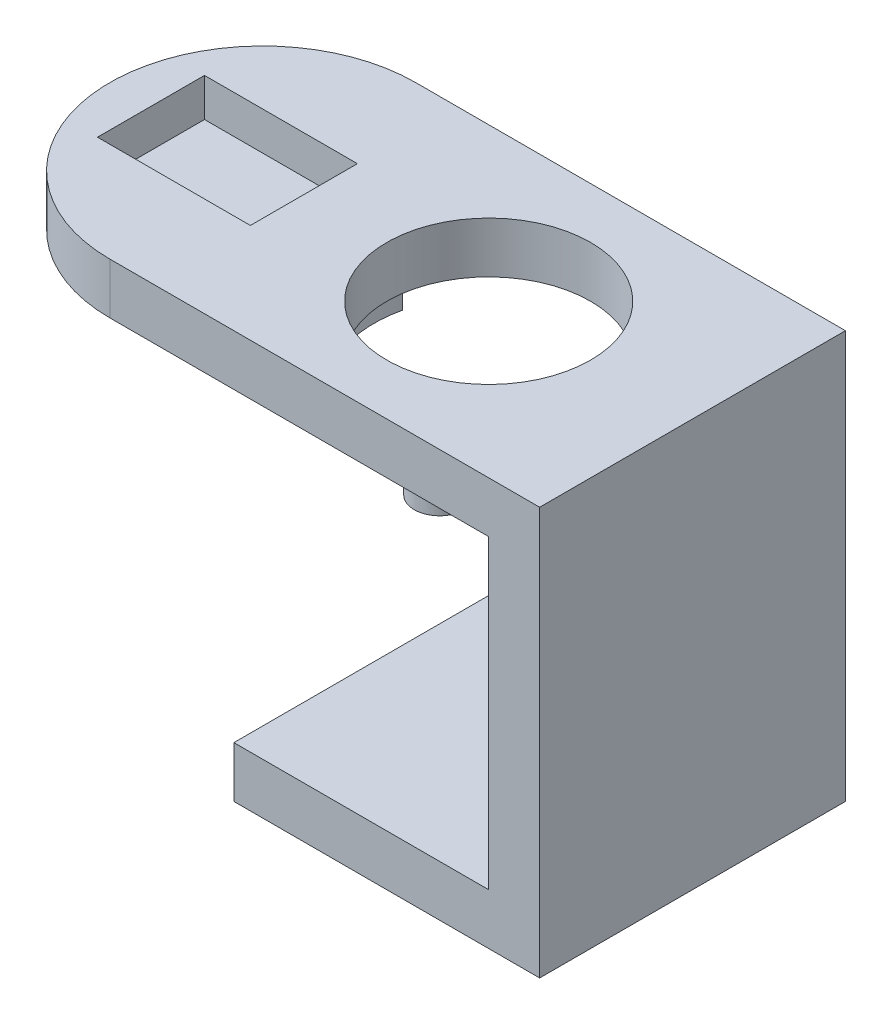
ISO-10303-21;
HEADER;
FILE_DESCRIPTION(('STEP AP214'),'2;1');
FILE_NAME('part.step','',(''),(''),'','','');
FILE_SCHEMA(('AUTOMOTIVE_DESIGN { 1 0 10303 214 1 1 1 1 }'));
ENDSEC;
DATA;
#1=APPLICATION_CONTEXT('core data for automotive mechanical design processes');
#2=APPLICATION_PROTOCOL_DEFINITION('international standard','automotive_design',2000,#1);
#3=PRODUCT_CONTEXT('',#1,'mechanical');
#4=PRODUCT('Part','Part','',(#3));
#5=PRODUCT_RELATED_PRODUCT_CATEGORY('part','',(#4));
#6=PRODUCT_DEFINITION_FORMATION('','',#4);
#7=PRODUCT_DEFINITION_CONTEXT('part definition',#1,'design');
#8=PRODUCT_DEFINITION('design','',#6,#7);
#9=PRODUCT_DEFINITION_SHAPE('','',#8);
#10=(LENGTH_UNIT() NAMED_UNIT(*) SI_UNIT(.MILLI.,.METRE.));
#11=(NAMED_UNIT(*) PLANE_ANGLE_UNIT() SI_UNIT($,.RADIAN.));
#12=(NAMED_UNIT(*) SI_UNIT($,.STERADIAN.) SOLID_ANGLE_UNIT());
#13=UNCERTAINTY_MEASURE_WITH_UNIT(LENGTH_MEASURE(1.E-05),#10,'distance_accuracy_value','');
#14=(GEOMETRIC_REPRESENTATION_CONTEXT(3) GLOBAL_UNCERTAINTY_ASSIGNED_CONTEXT((#13)) GLOBAL_UNIT_ASSIGNED_CONTEXT((#10,
#11,#12)) REPRESENTATION_CONTEXT('',''));
#15=CARTESIAN_POINT('',(0.,0.,0.));
#16=DIRECTION('',(0.,0.,1.));
#17=DIRECTION('',(1.,0.,0.));
#18=AXIS2_PLACEMENT_3D('',#15,#16,#17);
#19=CARTESIAN_POINT('',(-20.,140.,120.));
#20=DIRECTION('',(0.,-1.,0.));
#21=DIRECTION('',(0.,0.,-1.));
#22=AXIS2_PLACEMENT_3D('',#19,#20,#21);
#23=PLANE('',#22);
#24=DIRECTION('',(0.,0.,-1.));
#25=VECTOR('',#24,1.);
#26=CARTESIAN_POINT('',(-20.,140.,120.));
#27=LINE('',#26,#25);
#28=CARTESIAN_POINT('',(-20.,140.,120.));
#29=VERTEX_POINT('',#28);
#30=CARTESIAN_POINT('',(-20.,140.,0.));
#31=VERTEX_POINT('',#30);
#32=EDGE_CURVE('E400',#29,#31,#27,.T.);
#33=ORIENTED_EDGE('',*,*,#32,.F.);
#34=DIRECTION('',(-1.,0.,0.));
#35=VECTOR('',#34,1.);
#36=CARTESIAN_POINT('',(0.,140.,120.));
#37=LINE('',#36,#35);
#38=CARTESIAN_POINT('',(-168.676760947637,140.,120.));
#39=VERTEX_POINT('',#38);
#40=EDGE_CURVE('E360',#29,#39,#37,.T.);
#41=ORIENTED_EDGE('',*,*,#40,.T.);
#42=CARTESIAN_POINT('',(-168.676760947637,140.,60.));
#43=DIRECTION('',(0.,-1.,0.));
#44=DIRECTION('',(0.,0.,-1.));
#45=AXIS2_PLACEMENT_3D('',#42,#43,#44);
#46=CIRCLE('',#45,60.);
#47=CARTESIAN_POINT('',(-168.676760947637,140.,0.));
#48=VERTEX_POINT('',#47);
#49=EDGE_CURVE('E374',#48,#39,#46,.F.);
#50=ORIENTED_EDGE('',*,*,#49,.F.);
#51=DIRECTION('',(-1.,0.,0.));
#52=VECTOR('',#51,1.);
#53=CARTESIAN_POINT('',(0.,140.,0.));
#54=LINE('',#53,#52);
#55=EDGE_CURVE('E361',#31,#48,#54,.T.);
#56=ORIENTED_EDGE('',*,*,#55,.F.);
#57=EDGE_LOOP('',(#33,#41,#50,#56));
#58=FACE_BOUND('',#57,.T.);
#59=CARTESIAN_POINT('',(-80.,140.,60.));
#60=DIRECTION('',(0.,-1.,0.));
#61=DIRECTION('',(0.,0.,-1.));
#62=AXIS2_PLACEMENT_3D('',#59,#60,#61);
#63=CIRCLE('',#62,40.);
#64=CARTESIAN_POINT('',(-80.,140.,20.));
#65=VERTEX_POINT('',#64);
#66=EDGE_CURVE('E356',#65,#65,#63,.F.);
#67=ORIENTED_EDGE('',*,*,#66,.T.);
#68=EDGE_LOOP('',(#67));
#69=FACE_BOUND('',#68,.T.);
#70=DIRECTION('',(0.500000000000004,0.,-0.866025403784437));
#71=VECTOR('',#70,1.);
#72=CARTESIAN_POINT('',(-25.3589838486232,140.,-14.6410161513781));
#73=LINE('',#72,#71);
#74=CARTESIAN_POINT('',(-49.4023349936762,140.,27.0032896160725));
#75=VERTEX_POINT('',#74);
#76=CARTESIAN_POINT('',(-45.0897459621559,140.,19.5336663013153));
#77=VERTEX_POINT('',#76);
#78=EDGE_CURVE('E270',#75,#77,#73,.T.);
#79=ORIENTED_EDGE('',*,*,#78,.T.);
#80=CARTESIAN_POINT('',(-53.7500000000003,140.,14.5336663013152));
#81=DIRECTION('',(0.,1.,0.));
#82=DIRECTION('',(0.,0.,1.));
#83=AXIS2_PLACEMENT_3D('',#80,#81,#82);
#84=CIRCLE('',#83,9.99999999999999);
#85=CARTESIAN_POINT('',(-62.4102540378447,140.,9.5336663013152));
#86=VERTEX_POINT('',#85);
#87=EDGE_CURVE('E296',#77,#86,#84,.T.);
#88=ORIENTED_EDGE('',*,*,#87,.T.);
#89=DIRECTION('',(0.500000000000005,0.,-0.866025403784436));
#90=VECTOR('',#89,1.);
#91=CARTESIAN_POINT('',(-42.6794919243119,140.,-24.6410161513782));
#92=LINE('',#91,#90);
#93=CARTESIAN_POINT('',(-66.7228430693653,140.,17.003289616073));
#94=VERTEX_POINT('',#93);
#95=EDGE_CURVE('E298',#94,#86,#92,.T.);
#96=ORIENTED_EDGE('',*,*,#95,.F.);
#97=CARTESIAN_POINT('',(-80.,140.,60.));
#98=DIRECTION('',(0.,1.,0.));
#99=DIRECTION('',(0.,0.,1.));
#100=AXIS2_PLACEMENT_3D('',#97,#98,#99);
#101=CIRCLE('',#100,45.);
#102=EDGE_CURVE('E283',#75,#94,#101,.T.);
#103=ORIENTED_EDGE('',*,*,#102,.F.);
#104=EDGE_LOOP('',(#79,#88,#96,#103));
#105=FACE_BOUND('',#104,.T.);
#106=DIRECTION('',(0.499999999999992,0.,0.866025403784444));
#107=VECTOR('',#106,1.);
#108=CARTESIAN_POINT('',(-94.6410161513764,140.,54.6410161513756));
#109=LINE('',#108,#107);
#110=CARTESIAN_POINT('',(-66.7228430693627,140.,102.996710383926));
#111=VERTEX_POINT('',#110);
#112=CARTESIAN_POINT('',(-62.4102540378435,140.,110.466333698682));
#113=VERTEX_POINT('',#112);
#114=EDGE_CURVE('E239',#111,#113,#109,.T.);
#115=ORIENTED_EDGE('',*,*,#114,.T.);
#116=CARTESIAN_POINT('',(-53.7499999999991,140.,105.466333698682));
#117=DIRECTION('',(0.,1.,0.));
#118=DIRECTION('',(0.,0.,1.));
#119=AXIS2_PLACEMENT_3D('',#116,#117,#118);
#120=CIRCLE('',#119,9.99999999999999);
#121=CARTESIAN_POINT('',(-45.0897459621547,140.,100.466333698682));
#122=VERTEX_POINT('',#121);
#123=EDGE_CURVE('E260',#113,#122,#120,.T.);
#124=ORIENTED_EDGE('',*,*,#123,.T.);
#125=DIRECTION('',(0.49999999999999,0.,0.866025403784445));
#126=VECTOR('',#125,1.);
#127=CARTESIAN_POINT('',(-77.3205080756875,140.,44.6410161513756));
#128=LINE('',#127,#126);
#129=CARTESIAN_POINT('',(-49.4023349936742,140.,92.9967103839256));
#130=VERTEX_POINT('',#129);
#131=EDGE_CURVE('E262',#130,#122,#128,.T.);
#132=ORIENTED_EDGE('',*,*,#131,.F.);
#133=CARTESIAN_POINT('',(-80.,140.,60.));
#134=DIRECTION('',(0.,1.,0.));
#135=DIRECTION('',(0.,0.,1.));
#136=AXIS2_PLACEMENT_3D('',#133,#134,#135);
#137=CIRCLE('',#136,45.);
#138=EDGE_CURVE('E247',#111,#130,#137,.T.);
#139=ORIENTED_EDGE('',*,*,#138,.F.);
#140=EDGE_LOOP('',(#115,#124,#132,#139));
#141=FACE_BOUND('',#140,.T.);
#142=DIRECTION('',(-1.,0.,0.));
#143=VECTOR('',#142,1.);
#144=CARTESIAN_POINT('',(0.,140.,70.0000000000001));
#145=LINE('',#144,#143);
#146=CARTESIAN_POINT('',(-123.874821936961,140.,70.));
#147=VERTEX_POINT('',#146);
#148=CARTESIAN_POINT('',(-132.5,140.,70.));
#149=VERTEX_POINT('',#148);
#150=EDGE_CURVE('E50',#147,#149,#145,.T.);
#151=ORIENTED_EDGE('',*,*,#150,.F.);
#152=CARTESIAN_POINT('',(-80.,140.,60.));
#153=DIRECTION('',(0.,1.,0.));
#154=DIRECTION('',(0.,0.,1.));
#155=AXIS2_PLACEMENT_3D('',#152,#153,#154);
#156=CIRCLE('',#155,45.);
#157=CARTESIAN_POINT('',(-123.874821936961,140.,50.));
#158=VERTEX_POINT('',#157);
#159=EDGE_CURVE('E233',#158,#147,#156,.T.);
#160=ORIENTED_EDGE('',*,*,#159,.F.);
#161=DIRECTION('',(-1.,0.,0.));
#162=VECTOR('',#161,1.);
#163=CARTESIAN_POINT('',(0.,140.,50.));
#164=LINE('',#163,#162);
#165=CARTESIAN_POINT('',(-132.5,140.,50.));
#166=VERTEX_POINT('',#165);
#167=EDGE_CURVE('E210',#158,#166,#164,.T.);
#168=ORIENTED_EDGE('',*,*,#167,.T.);
#169=CARTESIAN_POINT('',(-132.5,140.,60.));
#170=DIRECTION('',(0.,1.,0.));
#171=DIRECTION('',(0.,0.,1.));
#172=AXIS2_PLACEMENT_3D('',#169,#170,#171);
#173=CIRCLE('',#172,9.99999999999999);
#174=EDGE_CURVE('E55',#166,#149,#173,.T.);
#175=ORIENTED_EDGE('',*,*,#174,.T.);
#176=EDGE_LOOP('',(#151,#160,#168,#175));
#177=FACE_BOUND('',#176,.T.);
#178=ADVANCED_FACE('F35',(#58,#69,#105,#141,#177),#23,.T.);
#179=CARTESIAN_POINT('',(0.,160.,120.));
#180=DIRECTION('',(0.,-1.,0.));
#181=DIRECTION('',(1.,0.,0.));
#182=AXIS2_PLACEMENT_3D('',#179,#180,#181);
#183=PLANE('',#182);
#184=DIRECTION('',(-1.,0.,0.));
#185=VECTOR('',#184,1.);
#186=CARTESIAN_POINT('',(0.,160.,0.));
#187=LINE('',#186,#185);
#188=CARTESIAN_POINT('',(0.,160.,0.));
#189=VERTEX_POINT('',#188);
#190=CARTESIAN_POINT('',(-168.676760947637,160.,0.));
#191=VERTEX_POINT('',#190);
#192=EDGE_CURVE('E363',#189,#191,#187,.T.);
#193=ORIENTED_EDGE('',*,*,#192,.T.);
#194=CARTESIAN_POINT('',(-168.676760947637,160.,60.));
#195=DIRECTION('',(0.,1.,0.));
#196=DIRECTION('',(-1.,0.,0.));
#197=AXIS2_PLACEMENT_3D('',#194,#195,#196);
#198=CIRCLE('',#197,60.);
#199=CARTESIAN_POINT('',(-168.676760947637,160.,120.));
#200=VERTEX_POINT('',#199);
#201=EDGE_CURVE('E377',#191,#200,#198,.T.);
#202=ORIENTED_EDGE('',*,*,#201,.T.);
#203=DIRECTION('',(-1.,0.,0.));
#204=VECTOR('',#203,1.);
#205=CARTESIAN_POINT('',(0.,160.,120.));
#206=LINE('',#205,#204);
#207=CARTESIAN_POINT('',(0.,160.,120.));
#208=VERTEX_POINT('',#207);
#209=EDGE_CURVE('E364',#208,#200,#206,.T.);
#210=ORIENTED_EDGE('',*,*,#209,.F.);
#211=DIRECTION('',(0.,0.,-1.));
#212=VECTOR('',#211,1.);
#213=CARTESIAN_POINT('',(0.,160.,120.));
#214=LINE('',#213,#212);
#215=EDGE_CURVE('E357',#208,#189,#214,.T.);
#216=ORIENTED_EDGE('',*,*,#215,.T.);
#217=EDGE_LOOP('',(#193,#202,#210,#216));
#218=FACE_BOUND('',#217,.T.);
#219=CARTESIAN_POINT('',(-80.,160.,60.));
#220=DIRECTION('',(0.,-1.,0.));
#221=DIRECTION('',(1.,0.,0.));
#222=AXIS2_PLACEMENT_3D('',#219,#220,#221);
#223=CIRCLE('',#222,40.);
#224=CARTESIAN_POINT('',(-40.,160.,60.));
#225=VERTEX_POINT('',#224);
#226=EDGE_CURVE('E380',#225,#225,#223,.T.);
#227=ORIENTED_EDGE('',*,*,#226,.T.);
#228=EDGE_LOOP('',(#227));
#229=FACE_BOUND('',#228,.T.);
#230=DIRECTION('',(1.,0.,0.));
#231=VECTOR('',#230,1.);
#232=CARTESIAN_POINT('',(0.,160.,39.));
#233=LINE('',#232,#231);
#234=CARTESIAN_POINT('',(-212.526760947637,160.,39.));
#235=VERTEX_POINT('',#234);
#236=CARTESIAN_POINT('',(-152.526760947637,160.,39.));
#237=VERTEX_POINT('',#236);
#238=EDGE_CURVE('E306',#235,#237,#233,.T.);
#239=ORIENTED_EDGE('',*,*,#238,.T.);
#240=DIRECTION('',(0.,0.,1.));
#241=VECTOR('',#240,1.);
#242=CARTESIAN_POINT('',(-152.526760947637,160.,0.));
#243=LINE('',#242,#241);
#244=CARTESIAN_POINT('',(-152.526760947637,160.,81.));
#245=VERTEX_POINT('',#244);
#246=EDGE_CURVE('E319',#237,#245,#243,.T.);
#247=ORIENTED_EDGE('',*,*,#246,.T.);
#248=DIRECTION('',(1.,0.,0.));
#249=VECTOR('',#248,1.);
#250=CARTESIAN_POINT('',(0.,160.,81.));
#251=LINE('',#250,#249);
#252=CARTESIAN_POINT('',(-212.526760947637,160.,81.));
#253=VERTEX_POINT('',#252);
#254=EDGE_CURVE('E333',#253,#245,#251,.T.);
#255=ORIENTED_EDGE('',*,*,#254,.F.);
#256=DIRECTION('',(0.,0.,1.));
#257=VECTOR('',#256,1.);
#258=CARTESIAN_POINT('',(-212.526760947637,160.,0.));
#259=LINE('',#258,#257);
#260=EDGE_CURVE('E330',#235,#253,#259,.T.);
#261=ORIENTED_EDGE('',*,*,#260,.F.);
#262=EDGE_LOOP('',(#239,#247,#255,#261));
#263=FACE_BOUND('',#262,.T.);
#264=ADVANCED_FACE('F452',(#218,#229,#263),#183,.F.);
#265=CARTESIAN_POINT('',(-120.,0.,120.));
#266=DIRECTION('',(-1.,0.,0.));
#267=DIRECTION('',(0.,0.,1.));
#268=AXIS2_PLACEMENT_3D('',#265,#266,#267);
#269=PLANE('',#268);
#270=DIRECTION('',(0.,1.,0.));
#271=VECTOR('',#270,1.);
#272=CARTESIAN_POINT('',(-120.,0.,0.));
#273=LINE('',#272,#271);
#274=CARTESIAN_POINT('',(-120.,0.,0.));
#275=VERTEX_POINT('',#274);
#276=CARTESIAN_POINT('',(-120.,20.,0.));
#277=VERTEX_POINT('',#276);
#278=EDGE_CURVE('E406',#275,#277,#273,.T.);
#279=ORIENTED_EDGE('',*,*,#278,.F.);
#280=DIRECTION('',(0.,0.,-1.));
#281=VECTOR('',#280,1.);
#282=CARTESIAN_POINT('',(-120.,0.,120.));
#283=LINE('',#282,#281);
#284=CARTESIAN_POINT('',(-120.,0.,120.));
#285=VERTEX_POINT('',#284);
#286=EDGE_CURVE('E417',#285,#275,#283,.T.);
#287=ORIENTED_EDGE('',*,*,#286,.F.);
#288=DIRECTION('',(0.,1.,0.));
#289=VECTOR('',#288,1.);
#290=CARTESIAN_POINT('',(-120.,0.,120.));
#291=LINE('',#290,#289);
#292=CARTESIAN_POINT('',(-120.,20.,120.));
#293=VERTEX_POINT('',#292);
#294=EDGE_CURVE('E392',#285,#293,#291,.T.);
#295=ORIENTED_EDGE('',*,*,#294,.T.);
#296=DIRECTION('',(0.,0.,-1.));
#297=VECTOR('',#296,1.);
#298=CARTESIAN_POINT('',(-120.,20.,120.));
#299=LINE('',#298,#297);
#300=EDGE_CURVE('E43',#293,#277,#299,.T.);
#301=ORIENTED_EDGE('',*,*,#300,.T.);
#302=EDGE_LOOP('',(#279,#287,#295,#301));
#303=FACE_BOUND('',#302,.T.);
#304=ADVANCED_FACE('F421',(#303),#269,.T.);
#305=CARTESIAN_POINT('',(0.,20.,120.));
#306=DIRECTION('',(0.,-1.,0.));
#307=DIRECTION('',(0.,0.,-1.));
#308=AXIS2_PLACEMENT_3D('',#305,#306,#307);
#309=PLANE('',#308);
#310=DIRECTION('',(-1.,0.,0.));
#311=VECTOR('',#310,1.);
#312=CARTESIAN_POINT('',(0.,20.,0.));
#313=LINE('',#312,#311);
#314=CARTESIAN_POINT('',(-20.,20.,0.));
#315=VERTEX_POINT('',#314);
#316=EDGE_CURVE('E403',#315,#277,#313,.T.);
#317=ORIENTED_EDGE('',*,*,#316,.T.);
#318=ORIENTED_EDGE('',*,*,#300,.F.);
#319=DIRECTION('',(-1.,0.,0.));
#320=VECTOR('',#319,1.);
#321=CARTESIAN_POINT('',(0.,20.,120.));
#322=LINE('',#321,#320);
#323=CARTESIAN_POINT('',(-20.,20.,120.));
#324=VERTEX_POINT('',#323);
#325=EDGE_CURVE('E389',#324,#293,#322,.T.);
#326=ORIENTED_EDGE('',*,*,#325,.F.);
#327=DIRECTION('',(0.,0.,-1.));
#328=VECTOR('',#327,1.);
#329=CARTESIAN_POINT('',(-20.,20.,120.));
#330=LINE('',#329,#328);
#331=EDGE_CURVE('E11',#324,#315,#330,.T.);
#332=ORIENTED_EDGE('',*,*,#331,.T.);
#333=EDGE_LOOP('',(#317,#318,#326,#332));
#334=FACE_BOUND('',#333,.T.);
#335=ADVANCED_FACE('F426',(#334),#309,.F.);
#336=CARTESIAN_POINT('',(0.,0.,120.));
#337=DIRECTION('',(0.,-1.,0.));
#338=DIRECTION('',(0.,0.,-1.));
#339=AXIS2_PLACEMENT_3D('',#336,#337,#338);
#340=PLANE('',#339);
#341=DIRECTION('',(-1.,0.,0.));
#342=VECTOR('',#341,1.);
#343=CARTESIAN_POINT('',(0.,0.,0.));
#344=LINE('',#343,#342);
#345=CARTESIAN_POINT('',(0.,0.,0.));
#346=VERTEX_POINT('',#345);
#347=EDGE_CURVE('E409',#346,#275,#344,.T.);
#348=ORIENTED_EDGE('',*,*,#347,.F.);
#349=DIRECTION('',(0.,0.,-1.));
#350=VECTOR('',#349,1.);
#351=CARTESIAN_POINT('',(0.,0.,120.));
#352=LINE('',#351,#350);
#353=CARTESIAN_POINT('',(0.,0.,120.));
#354=VERTEX_POINT('',#353);
#355=EDGE_CURVE('E415',#354,#346,#352,.T.);
#356=ORIENTED_EDGE('',*,*,#355,.F.);
#357=DIRECTION('',(-1.,0.,0.));
#358=VECTOR('',#357,1.);
#359=CARTESIAN_POINT('',(0.,0.,120.));
#360=LINE('',#359,#358);
#361=EDGE_CURVE('E395',#354,#285,#360,.T.);
#362=ORIENTED_EDGE('',*,*,#361,.T.);
#363=ORIENTED_EDGE('',*,*,#286,.T.);
#364=EDGE_LOOP('',(#348,#356,#362,#363));
#365=FACE_BOUND('',#364,.T.);
#366=ADVANCED_FACE('F434',(#365),#340,.T.);
#367=CARTESIAN_POINT('',(0.,0.,120.));
#368=DIRECTION('',(0.,0.,1.));
#369=DIRECTION('',(1.,0.,0.));
#370=AXIS2_PLACEMENT_3D('',#367,#368,#369);
#371=PLANE('',#370);
#372=DIRECTION('',(0.,1.,0.));
#373=VECTOR('',#372,1.);
#374=CARTESIAN_POINT('',(0.,0.,120.));
#375=LINE('',#374,#373);
#376=EDGE_CURVE('E398',#354,#208,#375,.T.);
#377=ORIENTED_EDGE('',*,*,#376,.T.);
#378=ORIENTED_EDGE('',*,*,#209,.T.);
#379=DIRECTION('',(0.,1.,0.));
#380=VECTOR('',#379,1.);
#381=CARTESIAN_POINT('',(-168.676760947637,1.73757743240954,120.));
#382=LINE('',#381,#380);
#383=EDGE_CURVE('E371',#39,#200,#382,.T.);
#384=ORIENTED_EDGE('',*,*,#383,.F.);
#385=ORIENTED_EDGE('',*,*,#40,.F.);
#386=DIRECTION('',(0.,1.,0.));
#387=VECTOR('',#386,1.);
#388=CARTESIAN_POINT('',(-20.,0.,120.));
#389=LINE('',#388,#387);
#390=EDGE_CURVE('E386',#324,#29,#389,.T.);
#391=ORIENTED_EDGE('',*,*,#390,.F.);
#392=ORIENTED_EDGE('',*,*,#325,.T.);
#393=ORIENTED_EDGE('',*,*,#294,.F.);
#394=ORIENTED_EDGE('',*,*,#361,.F.);
#395=EDGE_LOOP('',(#377,#378,#384,#385,#391,#392,#393,#394));
#396=FACE_BOUND('',#395,.T.);
#397=ADVANCED_FACE('F438',(#396),#371,.T.);
#398=CARTESIAN_POINT('',(0.,0.,0.));
#399=DIRECTION('',(0.,0.,1.));
#400=DIRECTION('',(1.,0.,0.));
#401=AXIS2_PLACEMENT_3D('',#398,#399,#400);
#402=PLANE('',#401);
#403=DIRECTION('',(0.,1.,0.));
#404=VECTOR('',#403,1.);
#405=CARTESIAN_POINT('',(-20.,0.,0.));
#406=LINE('',#405,#404);
#407=EDGE_CURVE('E383',#315,#31,#406,.T.);
#408=ORIENTED_EDGE('',*,*,#407,.T.);
#409=ORIENTED_EDGE('',*,*,#55,.T.);
#410=DIRECTION('',(0.,1.,0.));
#411=VECTOR('',#410,1.);
#412=CARTESIAN_POINT('',(-168.676760947637,1.73757743240954,0.));
#413=LINE('',#412,#411);
#414=EDGE_CURVE('E366',#48,#191,#413,.T.);
#415=ORIENTED_EDGE('',*,*,#414,.T.);
#416=ORIENTED_EDGE('',*,*,#192,.F.);
#417=DIRECTION('',(0.,1.,0.));
#418=VECTOR('',#417,1.);
#419=CARTESIAN_POINT('',(0.,0.,0.));
#420=LINE('',#419,#418);
#421=EDGE_CURVE('E390',#346,#189,#420,.T.);
#422=ORIENTED_EDGE('',*,*,#421,.F.);
#423=ORIENTED_EDGE('',*,*,#347,.T.);
#424=ORIENTED_EDGE('',*,*,#278,.T.);
#425=ORIENTED_EDGE('',*,*,#316,.F.);
#426=EDGE_LOOP('',(#408,#409,#415,#416,#422,#423,#424,#425));
#427=FACE_BOUND('',#426,.T.);
#428=ADVANCED_FACE('F429',(#427),#402,.F.);
#429=CARTESIAN_POINT('',(0.,0.,120.));
#430=DIRECTION('',(-1.,0.,0.));
#431=DIRECTION('',(0.,0.,1.));
#432=AXIS2_PLACEMENT_3D('',#429,#430,#431);
#433=PLANE('',#432);
#434=ORIENTED_EDGE('',*,*,#421,.T.);
#435=ORIENTED_EDGE('',*,*,#215,.F.);
#436=ORIENTED_EDGE('',*,*,#376,.F.);
#437=ORIENTED_EDGE('',*,*,#355,.T.);
#438=EDGE_LOOP('',(#434,#435,#436,#437));
#439=FACE_BOUND('',#438,.T.);
#440=ADVANCED_FACE('F456',(#439),#433,.F.);
#441=CARTESIAN_POINT('',(-20.,0.,120.));
#442=DIRECTION('',(-1.,0.,0.));
#443=DIRECTION('',(0.,0.,1.));
#444=AXIS2_PLACEMENT_3D('',#441,#442,#443);
#445=PLANE('',#444);
#446=ORIENTED_EDGE('',*,*,#407,.F.);
#447=ORIENTED_EDGE('',*,*,#331,.F.);
#448=ORIENTED_EDGE('',*,*,#390,.T.);
#449=ORIENTED_EDGE('',*,*,#32,.T.);
#450=EDGE_LOOP('',(#446,#447,#448,#449));
#451=FACE_BOUND('',#450,.T.);
#452=ADVANCED_FACE('F37',(#451),#445,.T.);
#453=CARTESIAN_POINT('',(-168.676760947637,1.73757743240954,60.));
#454=DIRECTION('',(0.,1.,0.));
#455=DIRECTION('',(-1.,0.,0.));
#456=AXIS2_PLACEMENT_3D('',#453,#454,#455);
#457=CYLINDRICAL_SURFACE('',#456,60.);
#458=ORIENTED_EDGE('',*,*,#414,.F.);
#459=ORIENTED_EDGE('',*,*,#49,.T.);
#460=ORIENTED_EDGE('',*,*,#383,.T.);
#461=ORIENTED_EDGE('',*,*,#201,.F.);
#462=EDGE_LOOP('',(#458,#459,#460,#461));
#463=FACE_BOUND('',#462,.T.);
#464=ADVANCED_FACE('F449',(#463),#457,.T.);
#465=CARTESIAN_POINT('',(-80.,165.,60.));
#466=DIRECTION('',(0.,-1.,0.));
#467=DIRECTION('',(0.,0.,-1.));
#468=AXIS2_PLACEMENT_3D('',#465,#466,#467);
#469=CYLINDRICAL_SURFACE('',#468,40.);
#470=ORIENTED_EDGE('',*,*,#226,.F.);
#471=EDGE_LOOP('',(#470));
#472=FACE_BOUND('',#471,.T.);
#473=ORIENTED_EDGE('',*,*,#66,.F.);
#474=EDGE_LOOP('',(#473));
#475=FACE_BOUND('',#474,.T.);
#476=ADVANCED_FACE('F473',(#472,#475),#469,.F.);
#477=CARTESIAN_POINT('',(0.,145.,39.));
#478=DIRECTION('',(0.,0.,1.));
#479=DIRECTION('',(1.,0.,0.));
#480=AXIS2_PLACEMENT_3D('',#477,#478,#479);
#481=PLANE('',#480);
#482=ORIENTED_EDGE('',*,*,#238,.F.);
#483=DIRECTION('',(0.,1.,0.));
#484=VECTOR('',#483,1.);
#485=CARTESIAN_POINT('',(-212.526760947637,145.,39.));
#486=LINE('',#485,#484);
#487=CARTESIAN_POINT('',(-212.526760947637,145.,39.));
#488=VERTEX_POINT('',#487);
#489=EDGE_CURVE('E327',#488,#235,#486,.T.);
#490=ORIENTED_EDGE('',*,*,#489,.F.);
#491=DIRECTION('',(1.,0.,0.));
#492=VECTOR('',#491,1.);
#493=CARTESIAN_POINT('',(0.,145.,39.));
#494=LINE('',#493,#492);
#495=CARTESIAN_POINT('',(-152.526760947637,145.,39.));
#496=VERTEX_POINT('',#495);
#497=EDGE_CURVE('E315',#488,#496,#494,.T.);
#498=ORIENTED_EDGE('',*,*,#497,.T.);
#499=DIRECTION('',(0.,1.,0.));
#500=VECTOR('',#499,1.);
#501=CARTESIAN_POINT('',(-152.526760947637,145.,39.));
#502=LINE('',#501,#500);
#503=EDGE_CURVE('E338',#496,#237,#502,.T.);
#504=ORIENTED_EDGE('',*,*,#503,.T.);
#505=EDGE_LOOP('',(#482,#490,#498,#504));
#506=FACE_BOUND('',#505,.T.);
#507=ADVANCED_FACE('F476',(#506),#481,.T.);
#508=CARTESIAN_POINT('',(-152.526760947637,145.,0.));
#509=DIRECTION('',(-1.,0.,0.));
#510=DIRECTION('',(0.,-1.,0.));
#511=AXIS2_PLACEMENT_3D('',#508,#509,#510);
#512=PLANE('',#511);
#513=ORIENTED_EDGE('',*,*,#246,.F.);
#514=ORIENTED_EDGE('',*,*,#503,.F.);
#515=DIRECTION('',(0.,0.,1.));
#516=VECTOR('',#515,1.);
#517=CARTESIAN_POINT('',(-152.526760947637,145.,0.));
#518=LINE('',#517,#516);
#519=CARTESIAN_POINT('',(-152.526760947637,145.,81.));
#520=VERTEX_POINT('',#519);
#521=EDGE_CURVE('E325',#496,#520,#518,.T.);
#522=ORIENTED_EDGE('',*,*,#521,.T.);
#523=DIRECTION('',(0.,1.,0.));
#524=VECTOR('',#523,1.);
#525=CARTESIAN_POINT('',(-152.526760947637,145.,81.));
#526=LINE('',#525,#524);
#527=EDGE_CURVE('E342',#520,#245,#526,.T.);
#528=ORIENTED_EDGE('',*,*,#527,.T.);
#529=EDGE_LOOP('',(#513,#514,#522,#528));
#530=FACE_BOUND('',#529,.T.);
#531=ADVANCED_FACE('F507',(#530),#512,.T.);
#532=CARTESIAN_POINT('',(0.,145.,81.));
#533=DIRECTION('',(0.,0.,1.));
#534=DIRECTION('',(1.,0.,0.));
#535=AXIS2_PLACEMENT_3D('',#532,#533,#534);
#536=PLANE('',#535);
#537=ORIENTED_EDGE('',*,*,#254,.T.);
#538=ORIENTED_EDGE('',*,*,#527,.F.);
#539=DIRECTION('',(1.,0.,0.));
#540=VECTOR('',#539,1.);
#541=CARTESIAN_POINT('',(0.,145.,81.));
#542=LINE('',#541,#540);
#543=CARTESIAN_POINT('',(-212.526760947637,145.,81.));
#544=VERTEX_POINT('',#543);
#545=EDGE_CURVE('E322',#544,#520,#542,.T.);
#546=ORIENTED_EDGE('',*,*,#545,.F.);
#547=DIRECTION('',(0.,1.,0.));
#548=VECTOR('',#547,1.);
#549=CARTESIAN_POINT('',(-212.526760947637,145.,81.));
#550=LINE('',#549,#548);
#551=EDGE_CURVE('E344',#544,#253,#550,.T.);
#552=ORIENTED_EDGE('',*,*,#551,.T.);
#553=EDGE_LOOP('',(#537,#538,#546,#552));
#554=FACE_BOUND('',#553,.T.);
#555=ADVANCED_FACE('F518',(#554),#536,.F.);
#556=CARTESIAN_POINT('',(-212.526760947637,145.,0.));
#557=DIRECTION('',(-1.,0.,0.));
#558=DIRECTION('',(0.,-1.,0.));
#559=AXIS2_PLACEMENT_3D('',#556,#557,#558);
#560=PLANE('',#559);
#561=ORIENTED_EDGE('',*,*,#260,.T.);
#562=ORIENTED_EDGE('',*,*,#551,.F.);
#563=DIRECTION('',(0.,0.,1.));
#564=VECTOR('',#563,1.);
#565=CARTESIAN_POINT('',(-212.526760947637,145.,0.));
#566=LINE('',#565,#564);
#567=EDGE_CURVE('E318',#488,#544,#566,.T.);
#568=ORIENTED_EDGE('',*,*,#567,.F.);
#569=ORIENTED_EDGE('',*,*,#489,.T.);
#570=EDGE_LOOP('',(#561,#562,#568,#569));
#571=FACE_BOUND('',#570,.T.);
#572=ADVANCED_FACE('F527',(#571),#560,.F.);
#573=CARTESIAN_POINT('',(0.,145.,0.));
#574=DIRECTION('',(0.,1.,0.));
#575=DIRECTION('',(-1.,0.,0.));
#576=AXIS2_PLACEMENT_3D('',#573,#574,#575);
#577=PLANE('',#576);
#578=ORIENTED_EDGE('',*,*,#497,.F.);
#579=ORIENTED_EDGE('',*,*,#567,.T.);
#580=ORIENTED_EDGE('',*,*,#545,.T.);
#581=ORIENTED_EDGE('',*,*,#521,.F.);
#582=EDGE_LOOP('',(#578,#579,#580,#581));
#583=FACE_BOUND('',#582,.T.);
#584=ADVANCED_FACE('F536',(#583),#577,.T.);
#585=CARTESIAN_POINT('',(-25.3589838486232,130.,-14.6410161513781));
#586=DIRECTION('',(0.866025403784437,0.,0.500000000000004));
#587=DIRECTION('',(0.500000000000004,0.,-0.866025403784437));
#588=AXIS2_PLACEMENT_3D('',#585,#586,#587);
#589=PLANE('',#588);
#590=ORIENTED_EDGE('',*,*,#78,.F.);
#591=DIRECTION('',(0.,1.,0.));
#592=VECTOR('',#591,1.);
#593=CARTESIAN_POINT('',(-49.4023349936762,130.,27.0032896160725));
#594=LINE('',#593,#592);
#595=CARTESIAN_POINT('',(-49.4023349936762,130.,27.0032896160725));
#596=VERTEX_POINT('',#595);
#597=EDGE_CURVE('E303',#596,#75,#594,.T.);
#598=ORIENTED_EDGE('',*,*,#597,.F.);
#599=DIRECTION('',(0.500000000000004,0.,-0.866025403784437));
#600=VECTOR('',#599,1.);
#601=CARTESIAN_POINT('',(-25.3589838486232,130.,-14.6410161513781));
#602=LINE('',#601,#600);
#603=CARTESIAN_POINT('',(-45.0897459621559,130.,19.5336663013153));
#604=VERTEX_POINT('',#603);
#605=EDGE_CURVE('E282',#596,#604,#602,.T.);
#606=ORIENTED_EDGE('',*,*,#605,.T.);
#607=DIRECTION('',(0.,1.,0.));
#608=VECTOR('',#607,1.);
#609=CARTESIAN_POINT('',(-45.0897459621559,130.,19.5336663013153));
#610=LINE('',#609,#608);
#611=EDGE_CURVE('E294',#604,#77,#610,.T.);
#612=ORIENTED_EDGE('',*,*,#611,.T.);
#613=EDGE_LOOP('',(#590,#598,#606,#612));
#614=FACE_BOUND('',#613,.T.);
#615=ADVANCED_FACE('F545',(#614),#589,.T.);
#616=CARTESIAN_POINT('',(-80.,130.,60.));
#617=DIRECTION('',(0.,1.,0.));
#618=DIRECTION('',(0.,0.,1.));
#619=AXIS2_PLACEMENT_3D('',#616,#617,#618);
#620=CYLINDRICAL_SURFACE('',#619,45.);
#621=ORIENTED_EDGE('',*,*,#102,.T.);
#622=DIRECTION('',(0.,1.,0.));
#623=VECTOR('',#622,1.);
#624=CARTESIAN_POINT('',(-66.7228430693652,130.,17.0032896160729));
#625=LINE('',#624,#623);
#626=CARTESIAN_POINT('',(-66.7228430693652,130.,17.0032896160729));
#627=VERTEX_POINT('',#626);
#628=EDGE_CURVE('E307',#627,#94,#625,.T.);
#629=ORIENTED_EDGE('',*,*,#628,.F.);
#630=CARTESIAN_POINT('',(-80.,130.,60.));
#631=DIRECTION('',(0.,1.,0.));
#632=DIRECTION('',(0.,0.,1.));
#633=AXIS2_PLACEMENT_3D('',#630,#631,#632);
#634=CIRCLE('',#633,45.);
#635=EDGE_CURVE('E291',#596,#627,#634,.T.);
#636=ORIENTED_EDGE('',*,*,#635,.F.);
#637=ORIENTED_EDGE('',*,*,#597,.T.);
#638=EDGE_LOOP('',(#621,#629,#636,#637));
#639=FACE_BOUND('',#638,.T.);
#640=ADVANCED_FACE('F555',(#639),#620,.F.);
#641=CARTESIAN_POINT('',(-42.6794919243119,130.,-24.6410161513782));
#642=DIRECTION('',(0.866025403784436,0.,0.500000000000005));
#643=DIRECTION('',(0.500000000000005,0.,-0.866025403784436));
#644=AXIS2_PLACEMENT_3D('',#641,#642,#643);
#645=PLANE('',#644);
#646=ORIENTED_EDGE('',*,*,#95,.T.);
#647=DIRECTION('',(0.,1.,0.));
#648=VECTOR('',#647,1.);
#649=CARTESIAN_POINT('',(-62.4102540378447,130.,9.5336663013152));
#650=LINE('',#649,#648);
#651=CARTESIAN_POINT('',(-62.4102540378447,130.,9.5336663013152));
#652=VERTEX_POINT('',#651);
#653=EDGE_CURVE('E310',#652,#86,#650,.T.);
#654=ORIENTED_EDGE('',*,*,#653,.F.);
#655=DIRECTION('',(0.500000000000005,0.,-0.866025403784436));
#656=VECTOR('',#655,1.);
#657=CARTESIAN_POINT('',(-42.6794919243119,130.,-24.6410161513782));
#658=LINE('',#657,#656);
#659=EDGE_CURVE('E289',#627,#652,#658,.T.);
#660=ORIENTED_EDGE('',*,*,#659,.F.);
#661=ORIENTED_EDGE('',*,*,#628,.T.);
#662=EDGE_LOOP('',(#646,#654,#660,#661));
#663=FACE_BOUND('',#662,.T.);
#664=ADVANCED_FACE('F563',(#663),#645,.F.);
#665=CARTESIAN_POINT('',(-53.7500000000003,130.,14.5336663013152));
#666=DIRECTION('',(0.,1.,0.));
#667=DIRECTION('',(0.,0.,1.));
#668=AXIS2_PLACEMENT_3D('',#665,#666,#667);
#669=CYLINDRICAL_SURFACE('',#668,9.99999999999999);
#670=ORIENTED_EDGE('',*,*,#87,.F.);
#671=ORIENTED_EDGE('',*,*,#611,.F.);
#672=CARTESIAN_POINT('',(-53.7500000000003,130.,14.5336663013152));
#673=DIRECTION('',(0.,1.,0.));
#674=DIRECTION('',(0.,0.,1.));
#675=AXIS2_PLACEMENT_3D('',#672,#673,#674);
#676=CIRCLE('',#675,9.99999999999999);
#677=EDGE_CURVE('E286',#604,#652,#676,.T.);
#678=ORIENTED_EDGE('',*,*,#677,.T.);
#679=ORIENTED_EDGE('',*,*,#653,.T.);
#680=EDGE_LOOP('',(#670,#671,#678,#679));
#681=FACE_BOUND('',#680,.T.);
#682=ADVANCED_FACE('F571',(#681),#669,.T.);
#683=CARTESIAN_POINT('',(0.,130.,0.));
#684=DIRECTION('',(0.,1.,0.));
#685=DIRECTION('',(0.,0.,1.));
#686=AXIS2_PLACEMENT_3D('',#683,#684,#685);
#687=PLANE('',#686);
#688=CARTESIAN_POINT('',(-53.7500000000003,130.,14.5336663013152));
#689=DIRECTION('',(0.,1.,0.));
#690=DIRECTION('',(0.,0.,1.));
#691=AXIS2_PLACEMENT_3D('',#688,#689,#690);
#692=CIRCLE('',#691,2.49999999999997);
#693=CARTESIAN_POINT('',(-53.7500000000003,130.,17.0336663013152));
#694=VERTEX_POINT('',#693);
#695=EDGE_CURVE('E279',#694,#694,#692,.T.);
#696=ORIENTED_EDGE('',*,*,#695,.T.);
#697=EDGE_LOOP('',(#696));
#698=FACE_BOUND('',#697,.T.);
#699=ORIENTED_EDGE('',*,*,#605,.F.);
#700=ORIENTED_EDGE('',*,*,#635,.T.);
#701=ORIENTED_EDGE('',*,*,#659,.T.);
#702=ORIENTED_EDGE('',*,*,#677,.F.);
#703=EDGE_LOOP('',(#699,#700,#701,#702));
#704=FACE_BOUND('',#703,.T.);
#705=ADVANCED_FACE('F579',(#698,#704),#687,.F.);
#706=CARTESIAN_POINT('',(-53.7500000000003,142.497848452431,14.5336663013152));
#707=DIRECTION('',(0.,-1.,0.));
#708=DIRECTION('',(0.,0.,-1.));
#709=AXIS2_PLACEMENT_3D('',#706,#707,#708);
#710=CONICAL_SURFACE('',#709,2.5,1.02974425867665);
#711=CARTESIAN_POINT('',(-53.7500000000003,144.,14.5336663013152));
#712=VERTEX_POINT('',#711);
#713=VERTEX_LOOP('',#712);
#714=FACE_BOUND('',#713,.T.);
#715=CARTESIAN_POINT('',(-53.7500000000003,142.497848452431,14.5336663013152));
#716=DIRECTION('',(0.,-1.,0.));
#717=DIRECTION('',(0.,0.,-1.));
#718=AXIS2_PLACEMENT_3D('',#715,#716,#717);
#719=CIRCLE('',#718,2.5);
#720=CARTESIAN_POINT('',(-53.7500000000003,142.497848452431,12.0336663013152));
#721=VERTEX_POINT('',#720);
#722=EDGE_CURVE('E341',#721,#721,#719,.T.);
#723=ORIENTED_EDGE('',*,*,#722,.T.);
#724=EDGE_LOOP('',(#723));
#725=FACE_BOUND('',#724,.T.);
#726=ADVANCED_FACE('F587',(#714,#725),#710,.F.);
#727=CARTESIAN_POINT('',(-53.7500000000003,140.,14.5336663013152));
#728=DIRECTION('',(0.,-1.,0.));
#729=DIRECTION('',(0.,0.,-1.));
#730=AXIS2_PLACEMENT_3D('',#727,#728,#729);
#731=CYLINDRICAL_SURFACE('',#730,2.5);
#732=ORIENTED_EDGE('',*,*,#722,.F.);
#733=EDGE_LOOP('',(#732));
#734=FACE_BOUND('',#733,.T.);
#735=ORIENTED_EDGE('',*,*,#695,.F.);
#736=EDGE_LOOP('',(#735));
#737=FACE_BOUND('',#736,.T.);
#738=ADVANCED_FACE('F596',(#734,#737),#731,.F.);
#739=CARTESIAN_POINT('',(-94.6410161513764,130.,54.6410161513756));
#740=DIRECTION('',(-0.866025403784444,0.,0.499999999999992));
#741=DIRECTION('',(0.499999999999992,0.,0.866025403784444));
#742=AXIS2_PLACEMENT_3D('',#739,#740,#741);
#743=PLANE('',#742);
#744=ORIENTED_EDGE('',*,*,#114,.F.);
#745=DIRECTION('',(0.,1.,0.));
#746=VECTOR('',#745,1.);
#747=CARTESIAN_POINT('',(-66.7228430693627,130.,102.996710383926));
#748=LINE('',#747,#746);
#749=CARTESIAN_POINT('',(-66.7228430693627,130.,102.996710383926));
#750=VERTEX_POINT('',#749);
#751=EDGE_CURVE('E267',#750,#111,#748,.T.);
#752=ORIENTED_EDGE('',*,*,#751,.F.);
#753=DIRECTION('',(0.499999999999992,0.,0.866025403784444));
#754=VECTOR('',#753,1.);
#755=CARTESIAN_POINT('',(-94.6410161513764,130.,54.6410161513756));
#756=LINE('',#755,#754);
#757=CARTESIAN_POINT('',(-62.4102540378435,130.,110.466333698682));
#758=VERTEX_POINT('',#757);
#759=EDGE_CURVE('E246',#750,#758,#756,.T.);
#760=ORIENTED_EDGE('',*,*,#759,.T.);
#761=DIRECTION('',(0.,1.,0.));
#762=VECTOR('',#761,1.);
#763=CARTESIAN_POINT('',(-62.4102540378435,130.,110.466333698682));
#764=LINE('',#763,#762);
#765=EDGE_CURVE('E258',#758,#113,#764,.T.);
#766=ORIENTED_EDGE('',*,*,#765,.T.);
#767=EDGE_LOOP('',(#744,#752,#760,#766));
#768=FACE_BOUND('',#767,.T.);
#769=ADVANCED_FACE('F605',(#768),#743,.T.);
#770=CARTESIAN_POINT('',(-80.,130.,60.));
#771=DIRECTION('',(0.,1.,0.));
#772=DIRECTION('',(0.,0.,1.));
#773=AXIS2_PLACEMENT_3D('',#770,#771,#772);
#774=CYLINDRICAL_SURFACE('',#773,45.);
#775=ORIENTED_EDGE('',*,*,#138,.T.);
#776=DIRECTION('',(0.,1.,0.));
#777=VECTOR('',#776,1.);
#778=CARTESIAN_POINT('',(-49.4023349936742,130.,92.9967103839256));
#779=LINE('',#778,#777);
#780=CARTESIAN_POINT('',(-49.4023349936742,130.,92.9967103839256));
#781=VERTEX_POINT('',#780);
#782=EDGE_CURVE('E271',#781,#130,#779,.T.);
#783=ORIENTED_EDGE('',*,*,#782,.F.);
#784=CARTESIAN_POINT('',(-80.,130.,60.));
#785=DIRECTION('',(0.,1.,0.));
#786=DIRECTION('',(0.,0.,1.));
#787=AXIS2_PLACEMENT_3D('',#784,#785,#786);
#788=CIRCLE('',#787,45.);
#789=EDGE_CURVE('E255',#750,#781,#788,.T.);
#790=ORIENTED_EDGE('',*,*,#789,.F.);
#791=ORIENTED_EDGE('',*,*,#751,.T.);
#792=EDGE_LOOP('',(#775,#783,#790,#791));
#793=FACE_BOUND('',#792,.T.);
#794=ADVANCED_FACE('F613',(#793),#774,.F.);
#795=CARTESIAN_POINT('',(-77.3205080756875,130.,44.6410161513756));
#796=DIRECTION('',(-0.866025403784445,0.,0.49999999999999));
#797=DIRECTION('',(0.49999999999999,0.,0.866025403784445));
#798=AXIS2_PLACEMENT_3D('',#795,#796,#797);
#799=PLANE('',#798);
#800=ORIENTED_EDGE('',*,*,#131,.T.);
#801=DIRECTION('',(0.,1.,0.));
#802=VECTOR('',#801,1.);
#803=CARTESIAN_POINT('',(-45.0897459621547,130.,100.466333698682));
#804=LINE('',#803,#802);
#805=CARTESIAN_POINT('',(-45.0897459621547,130.,100.466333698682));
#806=VERTEX_POINT('',#805);
#807=EDGE_CURVE('E274',#806,#122,#804,.T.);
#808=ORIENTED_EDGE('',*,*,#807,.F.);
#809=DIRECTION('',(0.49999999999999,0.,0.866025403784445));
#810=VECTOR('',#809,1.);
#811=CARTESIAN_POINT('',(-77.3205080756875,130.,44.6410161513756));
#812=LINE('',#811,#810);
#813=EDGE_CURVE('E253',#781,#806,#812,.T.);
#814=ORIENTED_EDGE('',*,*,#813,.F.);
#815=ORIENTED_EDGE('',*,*,#782,.T.);
#816=EDGE_LOOP('',(#800,#808,#814,#815));
#817=FACE_BOUND('',#816,.T.);
#818=ADVANCED_FACE('F621',(#817),#799,.F.);
#819=CARTESIAN_POINT('',(-53.7499999999991,130.,105.466333698682));
#820=DIRECTION('',(0.,1.,0.));
#821=DIRECTION('',(0.,0.,1.));
#822=AXIS2_PLACEMENT_3D('',#819,#820,#821);
#823=CYLINDRICAL_SURFACE('',#822,9.99999999999999);
#824=ORIENTED_EDGE('',*,*,#123,.F.);
#825=ORIENTED_EDGE('',*,*,#765,.F.);
#826=CARTESIAN_POINT('',(-53.7499999999991,130.,105.466333698682));
#827=DIRECTION('',(0.,1.,0.));
#828=DIRECTION('',(0.,0.,1.));
#829=AXIS2_PLACEMENT_3D('',#826,#827,#828);
#830=CIRCLE('',#829,9.99999999999999);
#831=EDGE_CURVE('E250',#758,#806,#830,.T.);
#832=ORIENTED_EDGE('',*,*,#831,.T.);
#833=ORIENTED_EDGE('',*,*,#807,.T.);
#834=EDGE_LOOP('',(#824,#825,#832,#833));
#835=FACE_BOUND('',#834,.T.);
#836=ADVANCED_FACE('F629',(#835),#823,.T.);
#837=CARTESIAN_POINT('',(0.,130.,0.));
#838=DIRECTION('',(0.,1.,0.));
#839=DIRECTION('',(0.,0.,1.));
#840=AXIS2_PLACEMENT_3D('',#837,#838,#839);
#841=PLANE('',#840);
#842=CARTESIAN_POINT('',(-53.7499999999991,130.,105.466333698682));
#843=DIRECTION('',(0.,1.,0.));
#844=DIRECTION('',(0.,0.,1.));
#845=AXIS2_PLACEMENT_3D('',#842,#843,#844);
#846=CIRCLE('',#845,2.49999999999999);
#847=CARTESIAN_POINT('',(-53.7499999999991,130.,107.966333698682));
#848=VERTEX_POINT('',#847);
#849=EDGE_CURVE('E243',#848,#848,#846,.T.);
#850=ORIENTED_EDGE('',*,*,#849,.T.);
#851=EDGE_LOOP('',(#850));
#852=FACE_BOUND('',#851,.T.);
#853=ORIENTED_EDGE('',*,*,#759,.F.);
#854=ORIENTED_EDGE('',*,*,#789,.T.);
#855=ORIENTED_EDGE('',*,*,#813,.T.);
#856=ORIENTED_EDGE('',*,*,#831,.F.);
#857=EDGE_LOOP('',(#853,#854,#855,#856));
#858=FACE_BOUND('',#857,.T.);
#859=ADVANCED_FACE('F637',(#852,#858),#841,.F.);
#860=CARTESIAN_POINT('',(-53.7499999999991,142.497848452431,105.466333698682));
#861=DIRECTION('',(0.,-1.,0.));
#862=DIRECTION('',(0.,0.,-1.));
#863=AXIS2_PLACEMENT_3D('',#860,#861,#862);
#864=CONICAL_SURFACE('',#863,2.5,1.02974425867665);
#865=CARTESIAN_POINT('',(-53.7499999999991,144.,105.466333698682));
#866=VERTEX_POINT('',#865);
#867=VERTEX_LOOP('',#866);
#868=FACE_BOUND('',#867,.T.);
#869=CARTESIAN_POINT('',(-53.7499999999991,142.497848452431,105.466333698682));
#870=DIRECTION('',(0.,-1.,0.));
#871=DIRECTION('',(0.,0.,-1.));
#872=AXIS2_PLACEMENT_3D('',#869,#870,#871);
#873=CIRCLE('',#872,2.5);
#874=CARTESIAN_POINT('',(-53.7499999999991,142.497848452431,102.966333698682));
#875=VERTEX_POINT('',#874);
#876=EDGE_CURVE('E353',#875,#875,#873,.T.);
#877=ORIENTED_EDGE('',*,*,#876,.T.);
#878=EDGE_LOOP('',(#877));
#879=FACE_BOUND('',#878,.T.);
#880=ADVANCED_FACE('F645',(#868,#879),#864,.F.);
#881=CARTESIAN_POINT('',(-53.7499999999991,140.,105.466333698682));
#882=DIRECTION('',(0.,-1.,0.));
#883=DIRECTION('',(0.,0.,-1.));
#884=AXIS2_PLACEMENT_3D('',#881,#882,#883);
#885=CYLINDRICAL_SURFACE('',#884,2.5);
#886=ORIENTED_EDGE('',*,*,#876,.F.);
#887=EDGE_LOOP('',(#886));
#888=FACE_BOUND('',#887,.T.);
#889=ORIENTED_EDGE('',*,*,#849,.F.);
#890=EDGE_LOOP('',(#889));
#891=FACE_BOUND('',#890,.T.);
#892=ADVANCED_FACE('F653',(#888,#891),#885,.F.);
#893=CARTESIAN_POINT('',(-80.,130.,60.));
#894=DIRECTION('',(0.,1.,0.));
#895=DIRECTION('',(0.,0.,1.));
#896=AXIS2_PLACEMENT_3D('',#893,#894,#895);
#897=CYLINDRICAL_SURFACE('',#896,45.);
#898=ORIENTED_EDGE('',*,*,#159,.T.);
#899=DIRECTION('',(0.,1.,0.));
#900=VECTOR('',#899,1.);
#901=CARTESIAN_POINT('',(-123.874821936961,130.,70.));
#902=LINE('',#901,#900);
#903=CARTESIAN_POINT('',(-123.874821936961,130.,70.));
#904=VERTEX_POINT('',#903);
#905=EDGE_CURVE('E220',#904,#147,#902,.T.);
#906=ORIENTED_EDGE('',*,*,#905,.F.);
#907=CARTESIAN_POINT('',(-80.,130.,60.));
#908=DIRECTION('',(0.,1.,0.));
#909=DIRECTION('',(0.,0.,1.));
#910=AXIS2_PLACEMENT_3D('',#907,#908,#909);
#911=CIRCLE('',#910,45.);
#912=CARTESIAN_POINT('',(-123.874821936961,130.,50.));
#913=VERTEX_POINT('',#912);
#914=EDGE_CURVE('E218',#913,#904,#911,.T.);
#915=ORIENTED_EDGE('',*,*,#914,.F.);
#916=DIRECTION('',(0.,1.,0.));
#917=VECTOR('',#916,1.);
#918=CARTESIAN_POINT('',(-123.874821936961,130.,50.));
#919=LINE('',#918,#917);
#920=EDGE_CURVE('E204',#913,#158,#919,.T.);
#921=ORIENTED_EDGE('',*,*,#920,.T.);
#922=EDGE_LOOP('',(#898,#906,#915,#921));
#923=FACE_BOUND('',#922,.T.);
#924=ADVANCED_FACE('F219',(#923),#897,.F.);
#925=CARTESIAN_POINT('',(0.,130.,70.0000000000001));
#926=DIRECTION('',(0.,0.,-1.));
#927=DIRECTION('',(-1.,0.,0.));
#928=AXIS2_PLACEMENT_3D('',#925,#926,#927);
#929=PLANE('',#928);
#930=ORIENTED_EDGE('',*,*,#150,.T.);
#931=DIRECTION('',(0.,1.,0.));
#932=VECTOR('',#931,1.);
#933=CARTESIAN_POINT('',(-132.5,130.,70.));
#934=LINE('',#933,#932);
#935=CARTESIAN_POINT('',(-132.5,130.,70.));
#936=VERTEX_POINT('',#935);
#937=EDGE_CURVE('E240',#936,#149,#934,.T.);
#938=ORIENTED_EDGE('',*,*,#937,.F.);
#939=DIRECTION('',(-1.,0.,0.));
#940=VECTOR('',#939,1.);
#941=CARTESIAN_POINT('',(0.,130.,70.0000000000001));
#942=LINE('',#941,#940);
#943=EDGE_CURVE('E214',#904,#936,#942,.T.);
#944=ORIENTED_EDGE('',*,*,#943,.F.);
#945=ORIENTED_EDGE('',*,*,#905,.T.);
#946=EDGE_LOOP('',(#930,#938,#944,#945));
#947=FACE_BOUND('',#946,.T.);
#948=ADVANCED_FACE('F669',(#947),#929,.F.);
#949=CARTESIAN_POINT('',(-132.5,130.,60.));
#950=DIRECTION('',(0.,1.,0.));
#951=DIRECTION('',(0.,0.,1.));
#952=AXIS2_PLACEMENT_3D('',#949,#950,#951);
#953=CYLINDRICAL_SURFACE('',#952,9.99999999999999);
#954=ORIENTED_EDGE('',*,*,#174,.F.);
#955=DIRECTION('',(0.,1.,0.));
#956=VECTOR('',#955,1.);
#957=CARTESIAN_POINT('',(-132.5,130.,50.));
#958=LINE('',#957,#956);
#959=CARTESIAN_POINT('',(-132.5,130.,50.));
#960=VERTEX_POINT('',#959);
#961=EDGE_CURVE('E213',#960,#166,#958,.T.);
#962=ORIENTED_EDGE('',*,*,#961,.F.);
#963=CARTESIAN_POINT('',(-132.5,130.,60.));
#964=DIRECTION('',(0.,1.,0.));
#965=DIRECTION('',(0.,0.,1.));
#966=AXIS2_PLACEMENT_3D('',#963,#964,#965);
#967=CIRCLE('',#966,9.99999999999999);
#968=EDGE_CURVE('E227',#960,#936,#967,.T.);
#969=ORIENTED_EDGE('',*,*,#968,.T.);
#970=ORIENTED_EDGE('',*,*,#937,.T.);
#971=EDGE_LOOP('',(#954,#962,#969,#970));
#972=FACE_BOUND('',#971,.T.);
#973=ADVANCED_FACE('F676',(#972),#953,.T.);
#974=CARTESIAN_POINT('',(0.,130.,50.));
#975=DIRECTION('',(0.,0.,-1.));
#976=DIRECTION('',(-1.,0.,0.));
#977=AXIS2_PLACEMENT_3D('',#974,#975,#976);
#978=PLANE('',#977);
#979=ORIENTED_EDGE('',*,*,#167,.F.);
#980=ORIENTED_EDGE('',*,*,#920,.F.);
#981=DIRECTION('',(-1.,0.,0.));
#982=VECTOR('',#981,1.);
#983=CARTESIAN_POINT('',(0.,130.,50.));
#984=LINE('',#983,#982);
#985=EDGE_CURVE('E209',#913,#960,#984,.T.);
#986=ORIENTED_EDGE('',*,*,#985,.T.);
#987=ORIENTED_EDGE('',*,*,#961,.T.);
#988=EDGE_LOOP('',(#979,#980,#986,#987));
#989=FACE_BOUND('',#988,.T.);
#990=ADVANCED_FACE('F206',(#989),#978,.T.);
#991=CARTESIAN_POINT('',(0.,130.,0.));
#992=DIRECTION('',(0.,1.,0.));
#993=DIRECTION('',(0.,0.,1.));
#994=AXIS2_PLACEMENT_3D('',#991,#992,#993);
#995=PLANE('',#994);
#996=CARTESIAN_POINT('',(-132.5,130.,60.));
#997=DIRECTION('',(0.,1.,0.));
#998=DIRECTION('',(0.,0.,1.));
#999=AXIS2_PLACEMENT_3D('',#996,#997,#998);
#1000=CIRCLE('',#999,2.49999999999999);
#1001=CARTESIAN_POINT('',(-132.5,130.,62.5));
#1002=VERTEX_POINT('',#1001);
#1003=EDGE_CURVE('E222',#1002,#1002,#1000,.T.);
#1004=ORIENTED_EDGE('',*,*,#1003,.T.);
#1005=EDGE_LOOP('',(#1004));
#1006=FACE_BOUND('',#1005,.T.);
#1007=ORIENTED_EDGE('',*,*,#914,.T.);
#1008=ORIENTED_EDGE('',*,*,#943,.T.);
#1009=ORIENTED_EDGE('',*,*,#968,.F.);
#1010=ORIENTED_EDGE('',*,*,#985,.F.);
#1011=EDGE_LOOP('',(#1007,#1008,#1009,#1010));
#1012=FACE_BOUND('',#1011,.T.);
#1013=ADVANCED_FACE('F225',(#1006,#1012),#995,.F.);
#1014=CARTESIAN_POINT('',(-132.5,142.497848452431,60.));
#1015=DIRECTION('',(0.,-1.,0.));
#1016=DIRECTION('',(0.,0.,-1.));
#1017=AXIS2_PLACEMENT_3D('',#1014,#1015,#1016);
#1018=CONICAL_SURFACE('',#1017,2.5,1.02974425867665);
#1019=CARTESIAN_POINT('',(-132.5,144.,60.));
#1020=VERTEX_POINT('',#1019);
#1021=VERTEX_LOOP('',#1020);
#1022=FACE_BOUND('',#1021,.T.);
#1023=CARTESIAN_POINT('',(-132.5,142.497848452431,60.));
#1024=DIRECTION('',(0.,-1.,0.));
#1025=DIRECTION('',(0.,0.,-1.));
#1026=AXIS2_PLACEMENT_3D('',#1023,#1024,#1025);
#1027=CIRCLE('',#1026,2.5);
#1028=CARTESIAN_POINT('',(-132.5,142.497848452431,57.5));
#1029=VERTEX_POINT('',#1028);
#1030=EDGE_CURVE('E350',#1029,#1029,#1027,.T.);
#1031=ORIENTED_EDGE('',*,*,#1030,.T.);
#1032=EDGE_LOOP('',(#1031));
#1033=FACE_BOUND('',#1032,.T.);
#1034=ADVANCED_FACE('F697',(#1022,#1033),#1018,.F.);
#1035=CARTESIAN_POINT('',(-132.5,140.,60.));
#1036=DIRECTION('',(0.,-1.,0.));
#1037=DIRECTION('',(0.,0.,-1.));
#1038=AXIS2_PLACEMENT_3D('',#1035,#1036,#1037);
#1039=CYLINDRICAL_SURFACE('',#1038,2.5);
#1040=ORIENTED_EDGE('',*,*,#1030,.F.);
#1041=EDGE_LOOP('',(#1040));
#1042=FACE_BOUND('',#1041,.T.);
#1043=ORIENTED_EDGE('',*,*,#1003,.F.);
#1044=EDGE_LOOP('',(#1043));
#1045=FACE_BOUND('',#1044,.T.);
#1046=ADVANCED_FACE('F706',(#1042,#1045),#1039,.F.);
#1047=CLOSED_SHELL('',(#178,#264,#304,#335,#366,#397,#428,#440,#452,#464,#476,#507,#531,#555,
#572,#584,#615,#640,#664,#682,#705,#726,#738,#769,#794,#818,#836,#859,#880,#892,#924,#948,#973,
#990,#1013,#1034,#1046));
#1048=MANIFOLD_SOLID_BREP('B2',#1047);
#1049=ADVANCED_BREP_SHAPE_REPRESENTATION('',(#18,#1048),#14);
#1050=SHAPE_DEFINITION_REPRESENTATION(#9,#1049);
ENDSEC;
END-ISO-10303-21;
